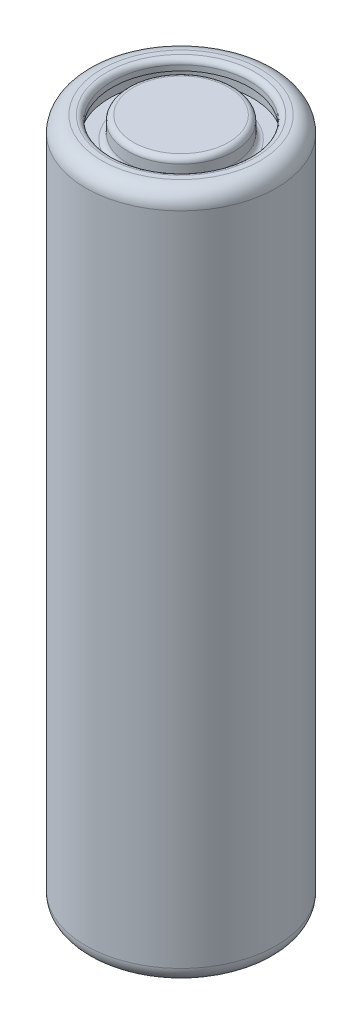
ISO-10303-21;
HEADER;
FILE_DESCRIPTION(('STEP AP214'),'2;1');
FILE_NAME('part.step','',(''),(''),'','','');
FILE_SCHEMA(('AUTOMOTIVE_DESIGN { 1 0 10303 214 1 1 1 1 }'));
ENDSEC;
DATA;
#1=APPLICATION_CONTEXT('core data for automotive mechanical design processes');
#2=APPLICATION_PROTOCOL_DEFINITION('international standard','automotive_design',2000,#1);
#3=PRODUCT_CONTEXT('',#1,'mechanical');
#4=PRODUCT('Part','Part','',(#3));
#5=PRODUCT_RELATED_PRODUCT_CATEGORY('part','',(#4));
#6=PRODUCT_DEFINITION_FORMATION('','',#4);
#7=PRODUCT_DEFINITION_CONTEXT('part definition',#1,'design');
#8=PRODUCT_DEFINITION('design','',#6,#7);
#9=PRODUCT_DEFINITION_SHAPE('','',#8);
#10=(LENGTH_UNIT() NAMED_UNIT(*) SI_UNIT(.MILLI.,.METRE.));
#11=(NAMED_UNIT(*) PLANE_ANGLE_UNIT() SI_UNIT($,.RADIAN.));
#12=(NAMED_UNIT(*) SI_UNIT($,.STERADIAN.) SOLID_ANGLE_UNIT());
#13=UNCERTAINTY_MEASURE_WITH_UNIT(LENGTH_MEASURE(1.E-05),#10,'distance_accuracy_value','');
#14=(GEOMETRIC_REPRESENTATION_CONTEXT(3) GLOBAL_UNCERTAINTY_ASSIGNED_CONTEXT((#13)) GLOBAL_UNIT_ASSIGNED_CONTEXT((#10,
#11,#12)) REPRESENTATION_CONTEXT('',''));
#15=CARTESIAN_POINT('',(0.,0.,0.));
#16=DIRECTION('',(0.,0.,1.));
#17=DIRECTION('',(1.,0.,0.));
#18=AXIS2_PLACEMENT_3D('',#15,#16,#17);
#19=CARTESIAN_POINT('',(0.,65.,0.));
#20=DIRECTION('',(0.,-1.,0.));
#21=DIRECTION('',(0.,0.,-1.));
#22=AXIS2_PLACEMENT_3D('',#19,#20,#21);
#23=CYLINDRICAL_SURFACE('',#22,9.);
#24=CARTESIAN_POINT('',(0.,1.5,0.));
#25=DIRECTION('',(0.,1.,0.));
#26=DIRECTION('',(0.,0.,1.));
#27=AXIS2_PLACEMENT_3D('',#24,#25,#26);
#28=CIRCLE('',#27,9.);
#29=CARTESIAN_POINT('',(0.,1.5,9.));
#30=VERTEX_POINT('',#29);
#31=EDGE_CURVE('E64',#30,#30,#28,.T.);
#32=ORIENTED_EDGE('',*,*,#31,.T.);
#33=EDGE_LOOP('',(#32));
#34=FACE_BOUND('',#33,.T.);
#35=CARTESIAN_POINT('',(0.,63.5,0.));
#36=DIRECTION('',(0.,1.,0.));
#37=DIRECTION('',(0.,0.,1.));
#38=AXIS2_PLACEMENT_3D('',#35,#36,#37);
#39=CIRCLE('',#38,9.);
#40=CARTESIAN_POINT('',(0.,63.5,9.));
#41=VERTEX_POINT('',#40);
#42=EDGE_CURVE('E67',#41,#41,#39,.F.);
#43=ORIENTED_EDGE('',*,*,#42,.T.);
#44=EDGE_LOOP('',(#43));
#45=FACE_BOUND('',#44,.T.);
#46=ADVANCED_FACE('F35',(#34,#45),#23,.T.);
#47=CARTESIAN_POINT('',(0.,65.,0.));
#48=DIRECTION('',(0.,1.,0.));
#49=DIRECTION('',(0.,0.,1.));
#50=AXIS2_PLACEMENT_3D('',#47,#48,#49);
#51=PLANE('',#50);
#52=CARTESIAN_POINT('',(0.,65.,0.));
#53=DIRECTION('',(0.,1.,0.));
#54=DIRECTION('',(0.,0.,1.));
#55=AXIS2_PLACEMENT_3D('',#52,#53,#54);
#56=CIRCLE('',#55,7.);
#57=CARTESIAN_POINT('',(0.,65.,7.));
#58=VERTEX_POINT('',#57);
#59=EDGE_CURVE('E55',#58,#58,#56,.F.);
#60=ORIENTED_EDGE('',*,*,#59,.T.);
#61=EDGE_LOOP('',(#60));
#62=FACE_BOUND('',#61,.T.);
#63=CARTESIAN_POINT('',(0.,65.,0.));
#64=DIRECTION('',(0.,1.,0.));
#65=DIRECTION('',(0.,0.,1.));
#66=AXIS2_PLACEMENT_3D('',#63,#64,#65);
#67=CIRCLE('',#66,7.5);
#68=CARTESIAN_POINT('',(0.,65.,7.5));
#69=VERTEX_POINT('',#68);
#70=EDGE_CURVE('E61',#69,#69,#67,.T.);
#71=ORIENTED_EDGE('',*,*,#70,.T.);
#72=EDGE_LOOP('',(#71));
#73=FACE_BOUND('',#72,.T.);
#74=ADVANCED_FACE('F99',(#62,#73),#51,.T.);
#75=CARTESIAN_POINT('',(0.,63.,0.));
#76=DIRECTION('',(0.,1.,0.));
#77=DIRECTION('',(0.,0.,1.));
#78=AXIS2_PLACEMENT_3D('',#75,#76,#77);
#79=CYLINDRICAL_SURFACE('',#78,6.5);
#80=CARTESIAN_POINT('',(0.,64.5,0.));
#81=DIRECTION('',(0.,1.,0.));
#82=DIRECTION('',(0.,0.,1.));
#83=AXIS2_PLACEMENT_3D('',#80,#81,#82);
#84=CIRCLE('',#83,6.5);
#85=CARTESIAN_POINT('',(0.,64.5,6.5));
#86=VERTEX_POINT('',#85);
#87=EDGE_CURVE('E58',#86,#86,#84,.T.);
#88=ORIENTED_EDGE('',*,*,#87,.T.);
#89=EDGE_LOOP('',(#88));
#90=FACE_BOUND('',#89,.T.);
#91=CARTESIAN_POINT('',(0.,64.,0.));
#92=DIRECTION('',(0.,1.,0.));
#93=DIRECTION('',(0.,0.,1.));
#94=AXIS2_PLACEMENT_3D('',#91,#92,#93);
#95=CIRCLE('',#94,6.5);
#96=CARTESIAN_POINT('',(0.,64.,6.5));
#97=VERTEX_POINT('',#96);
#98=EDGE_CURVE('E74',#97,#97,#95,.F.);
#99=ORIENTED_EDGE('',*,*,#98,.T.);
#100=EDGE_LOOP('',(#99));
#101=FACE_BOUND('',#100,.T.);
#102=ADVANCED_FACE('F96',(#90,#101),#79,.F.);
#103=CARTESIAN_POINT('',(0.,0.25,0.));
#104=DIRECTION('',(0.,-1.,0.));
#105=DIRECTION('',(0.,0.,-1.));
#106=AXIS2_PLACEMENT_3D('',#103,#104,#105);
#107=CYLINDRICAL_SURFACE('',#106,7.5);
#108=CARTESIAN_POINT('',(0.,0.25,0.));
#109=DIRECTION('',(0.,-1.,0.));
#110=DIRECTION('',(0.,0.,-1.));
#111=AXIS2_PLACEMENT_3D('',#108,#109,#110);
#112=CIRCLE('',#111,7.5);
#113=CARTESIAN_POINT('',(0.,0.25,-7.5));
#114=VERTEX_POINT('',#113);
#115=EDGE_CURVE('E70',#114,#114,#112,.T.);
#116=ORIENTED_EDGE('',*,*,#115,.F.);
#117=EDGE_LOOP('',(#116));
#118=FACE_BOUND('',#117,.T.);
#119=CARTESIAN_POINT('',(0.,0.,0.));
#120=DIRECTION('',(0.,-1.,0.));
#121=DIRECTION('',(0.,0.,-1.));
#122=AXIS2_PLACEMENT_3D('',#119,#120,#121);
#123=CIRCLE('',#122,7.5);
#124=CARTESIAN_POINT('',(0.,0.,-7.5));
#125=VERTEX_POINT('',#124);
#126=EDGE_CURVE('E71',#125,#125,#123,.T.);
#127=ORIENTED_EDGE('',*,*,#126,.T.);
#128=EDGE_LOOP('',(#127));
#129=FACE_BOUND('',#128,.T.);
#130=ADVANCED_FACE('F98',(#118,#129),#107,.F.);
#131=CARTESIAN_POINT('',(0.,0.25,0.));
#132=DIRECTION('',(0.,-1.,0.));
#133=DIRECTION('',(0.,0.,-1.));
#134=AXIS2_PLACEMENT_3D('',#131,#132,#133);
#135=PLANE('',#134);
#136=ORIENTED_EDGE('',*,*,#115,.T.);
#137=EDGE_LOOP('',(#136));
#138=FACE_BOUND('',#137,.T.);
#139=ADVANCED_FACE('F92',(#138),#135,.T.);
#140=CARTESIAN_POINT('',(0.,64.,0.));
#141=DIRECTION('',(0.,1.,0.));
#142=DIRECTION('',(0.,0.,1.));
#143=AXIS2_PLACEMENT_3D('',#140,#141,#142);
#144=PLANE('',#143);
#145=CARTESIAN_POINT('',(0.,64.,0.));
#146=DIRECTION('',(0.,1.,0.));
#147=DIRECTION('',(0.,0.,1.));
#148=AXIS2_PLACEMENT_3D('',#145,#146,#147);
#149=CIRCLE('',#148,6.75);
#150=CARTESIAN_POINT('',(0.,64.,6.75));
#151=VERTEX_POINT('',#150);
#152=EDGE_CURVE('E79',#151,#151,#149,.T.);
#153=ORIENTED_EDGE('',*,*,#152,.F.);
#154=EDGE_LOOP('',(#153));
#155=FACE_BOUND('',#154,.T.);
#156=ORIENTED_EDGE('',*,*,#98,.F.);
#157=EDGE_LOOP('',(#156));
#158=FACE_BOUND('',#157,.T.);
#159=ADVANCED_FACE('F89',(#155,#158),#144,.F.);
#160=CARTESIAN_POINT('',(0.,64.,0.));
#161=DIRECTION('',(0.,-1.,0.));
#162=DIRECTION('',(0.,0.,-1.));
#163=AXIS2_PLACEMENT_3D('',#160,#161,#162);
#164=CYLINDRICAL_SURFACE('',#163,6.75);
#165=ORIENTED_EDGE('',*,*,#152,.T.);
#166=EDGE_LOOP('',(#165));
#167=FACE_BOUND('',#166,.T.);
#168=CARTESIAN_POINT('',(0.,63.,0.));
#169=DIRECTION('',(0.,1.,0.));
#170=DIRECTION('',(0.,0.,1.));
#171=AXIS2_PLACEMENT_3D('',#168,#169,#170);
#172=CIRCLE('',#171,6.75);
#173=CARTESIAN_POINT('',(0.,63.,6.75));
#174=VERTEX_POINT('',#173);
#175=EDGE_CURVE('E80',#174,#174,#172,.T.);
#176=ORIENTED_EDGE('',*,*,#175,.F.);
#177=EDGE_LOOP('',(#176));
#178=FACE_BOUND('',#177,.T.);
#179=ADVANCED_FACE('F86',(#167,#178),#164,.F.);
#180=CARTESIAN_POINT('',(0.,65.,0.));
#181=DIRECTION('',(0.,1.,0.));
#182=DIRECTION('',(0.,0.,1.));
#183=AXIS2_PLACEMENT_3D('',#180,#181,#182);
#184=CIRCLE('',#183,4.5);
#185=CARTESIAN_POINT('',(0.,65.,4.5));
#186=VERTEX_POINT('',#185);
#187=EDGE_CURVE('E10',#186,#186,#184,.T.);
#188=ORIENTED_EDGE('',*,*,#187,.T.);
#189=EDGE_LOOP('',(#188));
#190=FACE_BOUND('',#189,.T.);
#191=ADVANCED_FACE('F110',(#190),#51,.T.);
#192=CARTESIAN_POINT('',(0.,63.,0.));
#193=DIRECTION('',(0.,1.,0.));
#194=DIRECTION('',(0.,0.,1.));
#195=AXIS2_PLACEMENT_3D('',#192,#193,#194);
#196=CYLINDRICAL_SURFACE('',#195,5.);
#197=CARTESIAN_POINT('',(0.,63.5,0.));
#198=DIRECTION('',(0.,1.,0.));
#199=DIRECTION('',(0.,0.,1.));
#200=AXIS2_PLACEMENT_3D('',#197,#198,#199);
#201=CIRCLE('',#200,5.);
#202=CARTESIAN_POINT('',(0.,63.5,5.));
#203=VERTEX_POINT('',#202);
#204=EDGE_CURVE('E46',#203,#203,#201,.T.);
#205=ORIENTED_EDGE('',*,*,#204,.T.);
#206=EDGE_LOOP('',(#205));
#207=FACE_BOUND('',#206,.T.);
#208=CARTESIAN_POINT('',(0.,64.5,0.));
#209=DIRECTION('',(0.,1.,0.));
#210=DIRECTION('',(0.,0.,1.));
#211=AXIS2_PLACEMENT_3D('',#208,#209,#210);
#212=CIRCLE('',#211,5.);
#213=CARTESIAN_POINT('',(0.,64.5,5.));
#214=VERTEX_POINT('',#213);
#215=EDGE_CURVE('E50',#214,#214,#212,.F.);
#216=ORIENTED_EDGE('',*,*,#215,.T.);
#217=EDGE_LOOP('',(#216));
#218=FACE_BOUND('',#217,.T.);
#219=ADVANCED_FACE('F141',(#207,#218),#196,.T.);
#220=CARTESIAN_POINT('',(0.,63.,0.));
#221=DIRECTION('',(0.,1.,0.));
#222=DIRECTION('',(0.,0.,1.));
#223=AXIS2_PLACEMENT_3D('',#220,#221,#222);
#224=PLANE('',#223);
#225=CARTESIAN_POINT('',(0.,63.,0.));
#226=DIRECTION('',(0.,1.,0.));
#227=DIRECTION('',(0.,0.,1.));
#228=AXIS2_PLACEMENT_3D('',#225,#226,#227);
#229=CIRCLE('',#228,5.5);
#230=CARTESIAN_POINT('',(0.,63.,5.5));
#231=VERTEX_POINT('',#230);
#232=EDGE_CURVE('E42',#231,#231,#229,.F.);
#233=ORIENTED_EDGE('',*,*,#232,.T.);
#234=EDGE_LOOP('',(#233));
#235=FACE_BOUND('',#234,.T.);
#236=ORIENTED_EDGE('',*,*,#175,.T.);
#237=EDGE_LOOP('',(#236));
#238=FACE_BOUND('',#237,.T.);
#239=ADVANCED_FACE('F123',(#235,#238),#224,.T.);
#240=CARTESIAN_POINT('',(0.,1.5,0.));
#241=DIRECTION('',(0.,1.,0.));
#242=DIRECTION('',(0.,0.,1.));
#243=AXIS2_PLACEMENT_3D('',#240,#241,#242);
#244=TOROIDAL_SURFACE('',#243,7.5,1.5);
#245=ORIENTED_EDGE('',*,*,#126,.F.);
#246=EDGE_LOOP('',(#245));
#247=FACE_BOUND('',#246,.T.);
#248=ORIENTED_EDGE('',*,*,#31,.F.);
#249=EDGE_LOOP('',(#248));
#250=FACE_BOUND('',#249,.T.);
#251=ADVANCED_FACE('F119',(#247,#250),#244,.T.);
#252=CARTESIAN_POINT('',(0.,63.5,0.));
#253=DIRECTION('',(0.,1.,0.));
#254=DIRECTION('',(0.,0.,1.));
#255=AXIS2_PLACEMENT_3D('',#252,#253,#254);
#256=TOROIDAL_SURFACE('',#255,7.5,1.5);
#257=ORIENTED_EDGE('',*,*,#42,.F.);
#258=EDGE_LOOP('',(#257));
#259=FACE_BOUND('',#258,.T.);
#260=ORIENTED_EDGE('',*,*,#70,.F.);
#261=EDGE_LOOP('',(#260));
#262=FACE_BOUND('',#261,.T.);
#263=ADVANCED_FACE('F122',(#259,#262),#256,.T.);
#264=CARTESIAN_POINT('',(0.,64.5,0.));
#265=DIRECTION('',(0.,1.,0.));
#266=DIRECTION('',(0.,0.,1.));
#267=AXIS2_PLACEMENT_3D('',#264,#265,#266);
#268=TOROIDAL_SURFACE('',#267,7.,0.5);
#269=ORIENTED_EDGE('',*,*,#59,.F.);
#270=EDGE_LOOP('',(#269));
#271=FACE_BOUND('',#270,.T.);
#272=ORIENTED_EDGE('',*,*,#87,.F.);
#273=EDGE_LOOP('',(#272));
#274=FACE_BOUND('',#273,.T.);
#275=ADVANCED_FACE('F127',(#271,#274),#268,.T.);
#276=CARTESIAN_POINT('',(0.,63.5,0.));
#277=DIRECTION('',(0.,1.,0.));
#278=DIRECTION('',(0.,0.,1.));
#279=AXIS2_PLACEMENT_3D('',#276,#277,#278);
#280=TOROIDAL_SURFACE('',#279,5.5,0.5);
#281=ORIENTED_EDGE('',*,*,#232,.F.);
#282=EDGE_LOOP('',(#281));
#283=FACE_BOUND('',#282,.T.);
#284=ORIENTED_EDGE('',*,*,#204,.F.);
#285=EDGE_LOOP('',(#284));
#286=FACE_BOUND('',#285,.T.);
#287=ADVANCED_FACE('F130',(#283,#286),#280,.F.);
#288=CARTESIAN_POINT('',(0.,64.5,0.));
#289=DIRECTION('',(0.,1.,0.));
#290=DIRECTION('',(0.,0.,1.));
#291=AXIS2_PLACEMENT_3D('',#288,#289,#290);
#292=TOROIDAL_SURFACE('',#291,4.5,0.5);
#293=ORIENTED_EDGE('',*,*,#215,.F.);
#294=EDGE_LOOP('',(#293));
#295=FACE_BOUND('',#294,.T.);
#296=ORIENTED_EDGE('',*,*,#187,.F.);
#297=EDGE_LOOP('',(#296));
#298=FACE_BOUND('',#297,.T.);
#299=ADVANCED_FACE('F37',(#295,#298),#292,.T.);
#300=CLOSED_SHELL('',(#46,#74,#102,#130,#139,#159,#179,#191,#219,#239,#251,#263,#275,#287,#299));
#301=MANIFOLD_SOLID_BREP('B2',#300);
#302=ADVANCED_BREP_SHAPE_REPRESENTATION('',(#18,#301),#14);
#303=SHAPE_DEFINITION_REPRESENTATION(#9,#302);
ENDSEC;
END-ISO-10303-21;
